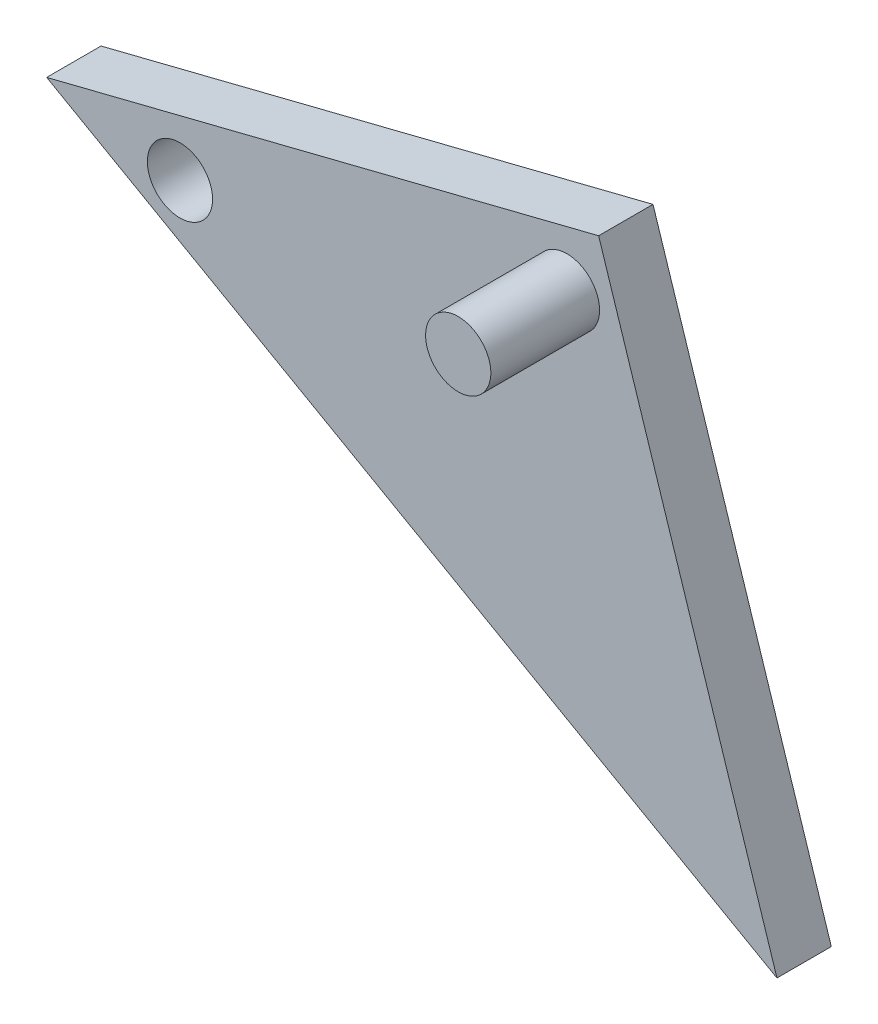
ISO-10303-21;
HEADER;
FILE_DESCRIPTION(('STEP AP214'),'2;1');
FILE_NAME('part.step','',(''),(''),'','','');
FILE_SCHEMA(('AUTOMOTIVE_DESIGN { 1 0 10303 214 1 1 1 1 }'));
ENDSEC;
DATA;
#1=APPLICATION_CONTEXT('core data for automotive mechanical design processes');
#2=APPLICATION_PROTOCOL_DEFINITION('international standard','automotive_design',2000,#1);
#3=PRODUCT_CONTEXT('',#1,'mechanical');
#4=PRODUCT('Part','Part','',(#3));
#5=PRODUCT_RELATED_PRODUCT_CATEGORY('part','',(#4));
#6=PRODUCT_DEFINITION_FORMATION('','',#4);
#7=PRODUCT_DEFINITION_CONTEXT('part definition',#1,'design');
#8=PRODUCT_DEFINITION('design','',#6,#7);
#9=PRODUCT_DEFINITION_SHAPE('','',#8);
#10=(LENGTH_UNIT() NAMED_UNIT(*) SI_UNIT(.MILLI.,.METRE.));
#11=(NAMED_UNIT(*) PLANE_ANGLE_UNIT() SI_UNIT($,.RADIAN.));
#12=(NAMED_UNIT(*) SI_UNIT($,.STERADIAN.) SOLID_ANGLE_UNIT());
#13=UNCERTAINTY_MEASURE_WITH_UNIT(LENGTH_MEASURE(1.E-05),#10,'distance_accuracy_value','');
#14=(GEOMETRIC_REPRESENTATION_CONTEXT(3) GLOBAL_UNCERTAINTY_ASSIGNED_CONTEXT((#13)) GLOBAL_UNIT_ASSIGNED_CONTEXT((#10,
#11,#12)) REPRESENTATION_CONTEXT('',''));
#15=CARTESIAN_POINT('',(0.,0.,0.));
#16=DIRECTION('',(0.,0.,1.));
#17=DIRECTION('',(1.,0.,0.));
#18=AXIS2_PLACEMENT_3D('',#15,#16,#17);
#19=CARTESIAN_POINT('',(0.,0.,5.));
#20=DIRECTION('',(0.,0.,-1.));
#21=DIRECTION('',(-1.,0.,0.));
#22=AXIS2_PLACEMENT_3D('',#19,#20,#21);
#23=PLANE('',#22);
#24=DIRECTION('',(0.869511965261455,-0.493911877025813,0.));
#25=VECTOR('',#24,1.);
#26=CARTESIAN_POINT('',(54.9066609138775,-36.0797531489405,5.));
#27=LINE('',#26,#25);
#28=CARTESIAN_POINT('',(-12.2584327533115,2.07226638514471,5.));
#29=VERTEX_POINT('',#28);
#30=CARTESIAN_POINT('',(54.9066609138775,-36.0797531489405,5.));
#31=VERTEX_POINT('',#30);
#32=EDGE_CURVE('E75',#29,#31,#27,.T.);
#33=ORIENTED_EDGE('',*,*,#32,.T.);
#34=DIRECTION('',(-0.306570879520987,0.951847832287141,0.));
#35=VECTOR('',#34,1.);
#36=CARTESIAN_POINT('',(38.5059425629364,14.8415484263661,5.));
#37=LINE('',#36,#35);
#38=CARTESIAN_POINT('',(38.5059425629364,14.8415484263661,5.));
#39=VERTEX_POINT('',#38);
#40=EDGE_CURVE('E71',#31,#39,#37,.T.);
#41=ORIENTED_EDGE('',*,*,#40,.T.);
#42=DIRECTION('',(-0.969790025515151,-0.243941194576322,0.));
#43=VECTOR('',#42,1.);
#44=CARTESIAN_POINT('',(-12.2584327533115,2.07226638514471,5.));
#45=LINE('',#44,#43);
#46=EDGE_CURVE('E51',#39,#29,#45,.T.);
#47=ORIENTED_EDGE('',*,*,#46,.T.);
#48=EDGE_LOOP('',(#33,#41,#47));
#49=FACE_BOUND('',#48,.T.);
#50=CARTESIAN_POINT('',(0.,0.,5.));
#51=DIRECTION('',(0.,0.,1.));
#52=DIRECTION('',(1.,0.,0.));
#53=AXIS2_PLACEMENT_3D('',#50,#51,#52);
#54=CIRCLE('',#53,3.);
#55=CARTESIAN_POINT('',(3.,0.,5.));
#56=VERTEX_POINT('',#55);
#57=EDGE_CURVE('E85',#56,#56,#54,.T.);
#58=ORIENTED_EDGE('',*,*,#57,.F.);
#59=EDGE_LOOP('',(#58));
#60=FACE_BOUND('',#59,.T.);
#61=CARTESIAN_POINT('',(35.591293936406,8.95264184095102,5.));
#62=DIRECTION('',(0.,0.,1.));
#63=DIRECTION('',(1.,0.,0.));
#64=AXIS2_PLACEMENT_3D('',#61,#62,#63);
#65=CIRCLE('',#64,3.);
#66=CARTESIAN_POINT('',(38.591293936406,8.95264184095102,5.));
#67=VERTEX_POINT('',#66);
#68=EDGE_CURVE('E172',#67,#67,#65,.T.);
#69=ORIENTED_EDGE('',*,*,#68,.F.);
#70=EDGE_LOOP('',(#69));
#71=FACE_BOUND('',#70,.T.);
#72=ADVANCED_FACE('F34',(#49,#60,#71),#23,.F.);
#73=CARTESIAN_POINT('',(0.,0.,0.));
#74=DIRECTION('',(0.,0.,-1.));
#75=DIRECTION('',(-1.,0.,0.));
#76=AXIS2_PLACEMENT_3D('',#73,#74,#75);
#77=PLANE('',#76);
#78=CARTESIAN_POINT('',(0.,0.,0.));
#79=DIRECTION('',(0.,0.,1.));
#80=DIRECTION('',(1.,0.,0.));
#81=AXIS2_PLACEMENT_3D('',#78,#79,#80);
#82=CIRCLE('',#81,3.);
#83=CARTESIAN_POINT('',(3.,0.,0.));
#84=VERTEX_POINT('',#83);
#85=EDGE_CURVE('E89',#84,#84,#82,.T.);
#86=ORIENTED_EDGE('',*,*,#85,.T.);
#87=EDGE_LOOP('',(#86));
#88=FACE_BOUND('',#87,.T.);
#89=DIRECTION('',(0.869511965261455,-0.493911877025813,0.));
#90=VECTOR('',#89,1.);
#91=CARTESIAN_POINT('',(54.9066609138775,-36.0797531489405,0.));
#92=LINE('',#91,#90);
#93=CARTESIAN_POINT('',(-12.2584327533115,2.07226638514471,0.));
#94=VERTEX_POINT('',#93);
#95=CARTESIAN_POINT('',(54.9066609138775,-36.0797531489405,0.));
#96=VERTEX_POINT('',#95);
#97=EDGE_CURVE('E82',#94,#96,#92,.T.);
#98=ORIENTED_EDGE('',*,*,#97,.F.);
#99=DIRECTION('',(-0.969790025515151,-0.243941194576322,0.));
#100=VECTOR('',#99,1.);
#101=CARTESIAN_POINT('',(-12.2584327533115,2.07226638514471,0.));
#102=LINE('',#101,#100);
#103=CARTESIAN_POINT('',(38.5059425629364,14.8415484263661,0.));
#104=VERTEX_POINT('',#103);
#105=EDGE_CURVE('E68',#104,#94,#102,.T.);
#106=ORIENTED_EDGE('',*,*,#105,.F.);
#107=DIRECTION('',(-0.306570879520987,0.951847832287141,0.));
#108=VECTOR('',#107,1.);
#109=CARTESIAN_POINT('',(38.5059425629364,14.8415484263661,0.));
#110=LINE('',#109,#108);
#111=EDGE_CURVE('E63',#96,#104,#110,.T.);
#112=ORIENTED_EDGE('',*,*,#111,.F.);
#113=EDGE_LOOP('',(#98,#106,#112));
#114=FACE_BOUND('',#113,.T.);
#115=ADVANCED_FACE('F95',(#88,#114),#77,.T.);
#116=CARTESIAN_POINT('',(54.9066609138775,-36.0797531489405,5.));
#117=DIRECTION('',(0.493911877025813,0.869511965261455,0.));
#118=DIRECTION('',(-0.869511965261455,0.493911877025813,0.));
#119=AXIS2_PLACEMENT_3D('',#116,#117,#118);
#120=PLANE('',#119);
#121=ORIENTED_EDGE('',*,*,#97,.T.);
#122=DIRECTION('',(0.,0.,-1.));
#123=VECTOR('',#122,1.);
#124=CARTESIAN_POINT('',(54.9066609138775,-36.0797531489405,5.));
#125=LINE('',#124,#123);
#126=EDGE_CURVE('E11',#31,#96,#125,.T.);
#127=ORIENTED_EDGE('',*,*,#126,.F.);
#128=ORIENTED_EDGE('',*,*,#32,.F.);
#129=DIRECTION('',(0.,0.,-1.));
#130=VECTOR('',#129,1.);
#131=CARTESIAN_POINT('',(-12.2584327533115,2.07226638514471,5.));
#132=LINE('',#131,#130);
#133=EDGE_CURVE('E83',#29,#94,#132,.T.);
#134=ORIENTED_EDGE('',*,*,#133,.T.);
#135=EDGE_LOOP('',(#121,#127,#128,#134));
#136=FACE_BOUND('',#135,.T.);
#137=ADVANCED_FACE('F36',(#136),#120,.F.);
#138=CARTESIAN_POINT('',(38.5059425629364,14.8415484263661,5.));
#139=DIRECTION('',(-0.951847832287141,-0.306570879520987,0.));
#140=DIRECTION('',(0.306570879520987,-0.951847832287141,0.));
#141=AXIS2_PLACEMENT_3D('',#138,#139,#140);
#142=PLANE('',#141);
#143=ORIENTED_EDGE('',*,*,#111,.T.);
#144=DIRECTION('',(0.,0.,-1.));
#145=VECTOR('',#144,1.);
#146=CARTESIAN_POINT('',(38.5059425629364,14.8415484263661,5.));
#147=LINE('',#146,#145);
#148=EDGE_CURVE('E43',#39,#104,#147,.T.);
#149=ORIENTED_EDGE('',*,*,#148,.F.);
#150=ORIENTED_EDGE('',*,*,#40,.F.);
#151=ORIENTED_EDGE('',*,*,#126,.T.);
#152=EDGE_LOOP('',(#143,#149,#150,#151));
#153=FACE_BOUND('',#152,.T.);
#154=ADVANCED_FACE('F72',(#153),#142,.F.);
#155=CARTESIAN_POINT('',(-12.2584327533115,2.07226638514471,5.));
#156=DIRECTION('',(0.243941194576322,-0.969790025515151,0.));
#157=DIRECTION('',(0.969790025515151,0.243941194576322,0.));
#158=AXIS2_PLACEMENT_3D('',#155,#156,#157);
#159=PLANE('',#158);
#160=ORIENTED_EDGE('',*,*,#105,.T.);
#161=ORIENTED_EDGE('',*,*,#133,.F.);
#162=ORIENTED_EDGE('',*,*,#46,.F.);
#163=ORIENTED_EDGE('',*,*,#148,.T.);
#164=EDGE_LOOP('',(#160,#161,#162,#163));
#165=FACE_BOUND('',#164,.T.);
#166=ADVANCED_FACE('F94',(#165),#159,.F.);
#167=CARTESIAN_POINT('',(0.,0.,5.));
#168=DIRECTION('',(0.,0.,-1.));
#169=DIRECTION('',(-1.,0.,0.));
#170=AXIS2_PLACEMENT_3D('',#167,#168,#169);
#171=CYLINDRICAL_SURFACE('',#170,3.);
#172=ORIENTED_EDGE('',*,*,#57,.T.);
#173=EDGE_LOOP('',(#172));
#174=FACE_BOUND('',#173,.T.);
#175=ORIENTED_EDGE('',*,*,#85,.F.);
#176=EDGE_LOOP('',(#175));
#177=FACE_BOUND('',#176,.T.);
#178=ADVANCED_FACE('F108',(#174,#177),#171,.F.);
#179=CARTESIAN_POINT('',(35.591293936406,8.95264184095102,15.));
#180=DIRECTION('',(0.,0.,-1.));
#181=DIRECTION('',(-1.,0.,0.));
#182=AXIS2_PLACEMENT_3D('',#179,#180,#181);
#183=CYLINDRICAL_SURFACE('',#182,3.);
#184=CARTESIAN_POINT('',(35.591293936406,8.95264184095102,15.));
#185=DIRECTION('',(0.,0.,-1.));
#186=DIRECTION('',(-1.,0.,0.));
#187=AXIS2_PLACEMENT_3D('',#184,#185,#186);
#188=CIRCLE('',#187,3.);
#189=CARTESIAN_POINT('',(32.591293936406,8.95264184095102,15.));
#190=VERTEX_POINT('',#189);
#191=EDGE_CURVE('E171',#190,#190,#188,.T.);
#192=ORIENTED_EDGE('',*,*,#191,.T.);
#193=EDGE_LOOP('',(#192));
#194=FACE_BOUND('',#193,.T.);
#195=ORIENTED_EDGE('',*,*,#68,.T.);
#196=EDGE_LOOP('',(#195));
#197=FACE_BOUND('',#196,.T.);
#198=ADVANCED_FACE('F124',(#194,#197),#183,.T.);
#199=CARTESIAN_POINT('',(35.591293936406,8.95264184095102,15.));
#200=DIRECTION('',(0.,0.,-1.));
#201=DIRECTION('',(-1.,0.,0.));
#202=AXIS2_PLACEMENT_3D('',#199,#200,#201);
#203=PLANE('',#202);
#204=ORIENTED_EDGE('',*,*,#191,.F.);
#205=EDGE_LOOP('',(#204));
#206=FACE_BOUND('',#205,.T.);
#207=ADVANCED_FACE('F131',(#206),#203,.F.);
#208=CLOSED_SHELL('',(#72,#115,#137,#154,#166,#178,#198,#207));
#209=MANIFOLD_SOLID_BREP('B2',#208);
#210=ADVANCED_BREP_SHAPE_REPRESENTATION('',(#18,#209),#14);
#211=SHAPE_DEFINITION_REPRESENTATION(#9,#210);
ENDSEC;
END-ISO-10303-21;
